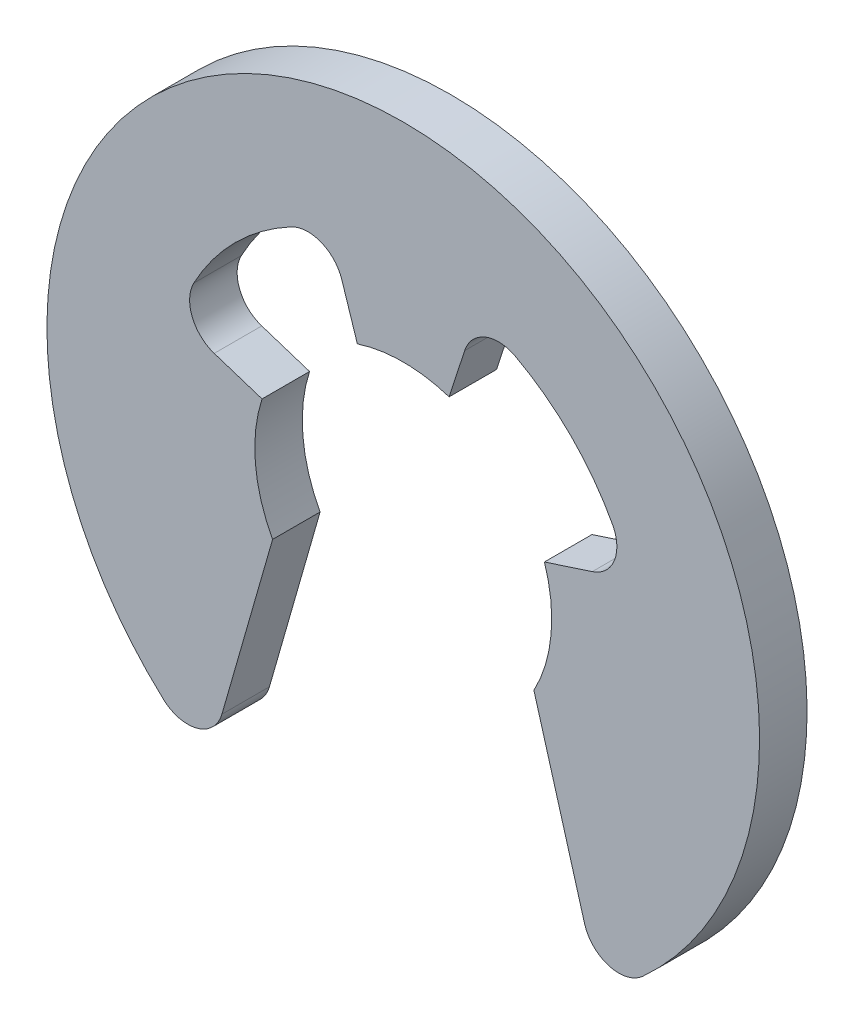
ISO-10303-21;
HEADER;
FILE_DESCRIPTION(('STEP AP214'),'2;1');
FILE_NAME('part.step','',(''),(''),'','','');
FILE_SCHEMA(('AUTOMOTIVE_DESIGN { 1 0 10303 214 1 1 1 1 }'));
ENDSEC;
DATA;
#1=APPLICATION_CONTEXT('core data for automotive mechanical design processes');
#2=APPLICATION_PROTOCOL_DEFINITION('international standard','automotive_design',2000,#1);
#3=PRODUCT_CONTEXT('',#1,'mechanical');
#4=PRODUCT('Part','Part','',(#3));
#5=PRODUCT_RELATED_PRODUCT_CATEGORY('part','',(#4));
#6=PRODUCT_DEFINITION_FORMATION('','',#4);
#7=PRODUCT_DEFINITION_CONTEXT('part definition',#1,'design');
#8=PRODUCT_DEFINITION('design','',#6,#7);
#9=PRODUCT_DEFINITION_SHAPE('','',#8);
#10=(LENGTH_UNIT() NAMED_UNIT(*) SI_UNIT(.MILLI.,.METRE.));
#11=(NAMED_UNIT(*) PLANE_ANGLE_UNIT() SI_UNIT($,.RADIAN.));
#12=(NAMED_UNIT(*) SI_UNIT($,.STERADIAN.) SOLID_ANGLE_UNIT());
#13=UNCERTAINTY_MEASURE_WITH_UNIT(LENGTH_MEASURE(1.E-05),#10,'distance_accuracy_value','');
#14=(GEOMETRIC_REPRESENTATION_CONTEXT(3) GLOBAL_UNCERTAINTY_ASSIGNED_CONTEXT((#13)) GLOBAL_UNIT_ASSIGNED_CONTEXT((#10,
#11,#12)) REPRESENTATION_CONTEXT('',''));
#15=CARTESIAN_POINT('',(0.,0.,0.));
#16=DIRECTION('',(0.,0.,1.));
#17=DIRECTION('',(1.,0.,0.));
#18=AXIS2_PLACEMENT_3D('',#15,#16,#17);
#19=CARTESIAN_POINT('',(1.49871684200533,0.802401288314995,-0.4));
#20=DIRECTION('',(0.,0.,1.));
#21=DIRECTION('',(1.,0.,0.));
#22=AXIS2_PLACEMENT_3D('',#19,#20,#21);
#23=CYLINDRICAL_SURFACE('',#22,0.3);
#24=CARTESIAN_POINT('',(1.49871684200533,0.802401288314995,0.));
#25=DIRECTION('',(0.,0.,-1.));
#26=DIRECTION('',(-1.,0.,0.));
#27=AXIS2_PLACEMENT_3D('',#24,#25,#26);
#28=CIRCLE('',#27,0.3);
#29=CARTESIAN_POINT('',(1.76319628471216,0.9440015156647,0.));
#30=VERTEX_POINT('',#29);
#31=CARTESIAN_POINT('',(1.59142194031782,0.51708433342645,0.));
#32=VERTEX_POINT('',#31);
#33=EDGE_CURVE('E191',#30,#32,#28,.T.);
#34=ORIENTED_EDGE('',*,*,#33,.F.);
#35=DIRECTION('',(0.,0.,1.));
#36=VECTOR('',#35,1.);
#37=CARTESIAN_POINT('',(1.76319628471216,0.9440015156647,-0.4));
#38=LINE('',#37,#36);
#39=CARTESIAN_POINT('',(1.76319628471216,0.9440015156647,-0.4));
#40=VERTEX_POINT('',#39);
#41=EDGE_CURVE('E11',#40,#30,#38,.T.);
#42=ORIENTED_EDGE('',*,*,#41,.F.);
#43=CARTESIAN_POINT('',(1.49871684200533,0.802401288314995,-0.4));
#44=DIRECTION('',(0.,0.,-1.));
#45=DIRECTION('',(-1.,0.,0.));
#46=AXIS2_PLACEMENT_3D('',#43,#44,#45);
#47=CIRCLE('',#46,0.3);
#48=CARTESIAN_POINT('',(1.59142194031782,0.51708433342645,-0.4));
#49=VERTEX_POINT('',#48);
#50=EDGE_CURVE('E241',#40,#49,#47,.T.);
#51=ORIENTED_EDGE('',*,*,#50,.T.);
#52=DIRECTION('',(0.,0.,1.));
#53=VECTOR('',#52,1.);
#54=CARTESIAN_POINT('',(1.59142194031782,0.51708433342645,-0.4));
#55=LINE('',#54,#53);
#56=EDGE_CURVE('E37',#49,#32,#55,.T.);
#57=ORIENTED_EDGE('',*,*,#56,.T.);
#58=EDGE_LOOP('',(#34,#42,#51,#57));
#59=FACE_BOUND('',#58,.T.);
#60=ADVANCED_FACE('F34',(#59),#23,.F.);
#61=CARTESIAN_POINT('',(0.,0.,-0.4));
#62=DIRECTION('',(0.,0.,1.));
#63=DIRECTION('',(1.,0.,0.));
#64=AXIS2_PLACEMENT_3D('',#61,#62,#63);
#65=CYLINDRICAL_SURFACE('',#64,2.);
#66=CARTESIAN_POINT('',(0.,0.,0.));
#67=DIRECTION('',(0.,0.,-1.));
#68=DIRECTION('',(1.,0.,0.));
#69=AXIS2_PLACEMENT_3D('',#66,#67,#68);
#70=CIRCLE('',#69,2.);
#71=CARTESIAN_POINT('',(0.944001515664686,1.76319628471216,0.));
#72=VERTEX_POINT('',#71);
#73=EDGE_CURVE('E239',#72,#30,#70,.T.);
#74=ORIENTED_EDGE('',*,*,#73,.F.);
#75=DIRECTION('',(0.,0.,1.));
#76=VECTOR('',#75,1.);
#77=CARTESIAN_POINT('',(0.944001515664686,1.76319628471216,-0.4));
#78=LINE('',#77,#76);
#79=CARTESIAN_POINT('',(0.944001515664686,1.76319628471216,-0.4));
#80=VERTEX_POINT('',#79);
#81=EDGE_CURVE('E43',#80,#72,#78,.T.);
#82=ORIENTED_EDGE('',*,*,#81,.F.);
#83=CARTESIAN_POINT('',(0.,0.,-0.4));
#84=DIRECTION('',(0.,0.,-1.));
#85=DIRECTION('',(1.,0.,0.));
#86=AXIS2_PLACEMENT_3D('',#83,#84,#85);
#87=CIRCLE('',#86,2.);
#88=EDGE_CURVE('E181',#80,#40,#87,.T.);
#89=ORIENTED_EDGE('',*,*,#88,.T.);
#90=ORIENTED_EDGE('',*,*,#41,.T.);
#91=EDGE_LOOP('',(#74,#82,#89,#90));
#92=FACE_BOUND('',#91,.T.);
#93=ADVANCED_FACE('F273',(#92),#65,.F.);
#94=CARTESIAN_POINT('',(0.802401288314984,1.49871684200534,-0.4));
#95=DIRECTION('',(0.,0.,1.));
#96=DIRECTION('',(1.,0.,0.));
#97=AXIS2_PLACEMENT_3D('',#94,#95,#96);
#98=CYLINDRICAL_SURFACE('',#97,0.3);
#99=CARTESIAN_POINT('',(0.802401288314984,1.49871684200534,0.));
#100=DIRECTION('',(0.,0.,-1.));
#101=DIRECTION('',(-1.,0.,0.));
#102=AXIS2_PLACEMENT_3D('',#99,#100,#101);
#103=CIRCLE('',#102,0.3);
#104=CARTESIAN_POINT('',(0.517084333426437,1.59142194031782,0.));
#105=VERTEX_POINT('',#104);
#106=EDGE_CURVE('E168',#105,#72,#103,.T.);
#107=ORIENTED_EDGE('',*,*,#106,.F.);
#108=DIRECTION('',(0.,0.,1.));
#109=VECTOR('',#108,1.);
#110=CARTESIAN_POINT('',(0.517084333426437,1.59142194031782,-0.4));
#111=LINE('',#110,#109);
#112=CARTESIAN_POINT('',(0.517084333426437,1.59142194031782,-0.4));
#113=VERTEX_POINT('',#112);
#114=EDGE_CURVE('E163',#113,#105,#111,.T.);
#115=ORIENTED_EDGE('',*,*,#114,.F.);
#116=CARTESIAN_POINT('',(0.802401288314984,1.49871684200534,-0.4));
#117=DIRECTION('',(0.,0.,-1.));
#118=DIRECTION('',(-1.,0.,0.));
#119=AXIS2_PLACEMENT_3D('',#116,#117,#118);
#120=CIRCLE('',#119,0.3);
#121=EDGE_CURVE('E166',#113,#80,#120,.T.);
#122=ORIENTED_EDGE('',*,*,#121,.T.);
#123=ORIENTED_EDGE('',*,*,#81,.T.);
#124=EDGE_LOOP('',(#107,#115,#122,#123));
#125=FACE_BOUND('',#124,.T.);
#126=ADVANCED_FACE('F165',(#125),#98,.F.);
#127=CARTESIAN_POINT('',(0.517084333426437,1.59142194031782,-0.4));
#128=DIRECTION('',(0.951056516295156,-0.309016994374941,0.));
#129=DIRECTION('',(0.309016994374941,0.951056516295156,0.));
#130=AXIS2_PLACEMENT_3D('',#127,#128,#129);
#131=PLANE('',#130);
#132=DIRECTION('',(0.309016994374941,0.951056516295156,0.));
#133=VECTOR('',#132,1.);
#134=CARTESIAN_POINT('',(0.517084333426437,1.59142194031782,0.));
#135=LINE('',#134,#133);
#136=CARTESIAN_POINT('',(0.386271242968676,1.18882064536895,0.));
#137=VERTEX_POINT('',#136);
#138=EDGE_CURVE('E236',#137,#105,#135,.T.);
#139=ORIENTED_EDGE('',*,*,#138,.F.);
#140=DIRECTION('',(0.,0.,1.));
#141=VECTOR('',#140,1.);
#142=CARTESIAN_POINT('',(0.386271242968676,1.18882064536895,-0.4));
#143=LINE('',#142,#141);
#144=CARTESIAN_POINT('',(0.386271242968676,1.18882064536895,-0.4));
#145=VERTEX_POINT('',#144);
#146=EDGE_CURVE('E173',#145,#137,#143,.T.);
#147=ORIENTED_EDGE('',*,*,#146,.F.);
#148=DIRECTION('',(0.309016994374941,0.951056516295156,0.));
#149=VECTOR('',#148,1.);
#150=CARTESIAN_POINT('',(0.517084333426437,1.59142194031782,-0.4));
#151=LINE('',#150,#149);
#152=EDGE_CURVE('E179',#145,#113,#151,.T.);
#153=ORIENTED_EDGE('',*,*,#152,.T.);
#154=ORIENTED_EDGE('',*,*,#114,.T.);
#155=EDGE_LOOP('',(#139,#147,#153,#154));
#156=FACE_BOUND('',#155,.T.);
#157=ADVANCED_FACE('F183',(#156),#131,.T.);
#158=CARTESIAN_POINT('',(0.,0.,-0.4));
#159=DIRECTION('',(0.,0.,1.));
#160=DIRECTION('',(1.,0.,0.));
#161=AXIS2_PLACEMENT_3D('',#158,#159,#160);
#162=CYLINDRICAL_SURFACE('',#161,1.25);
#163=CARTESIAN_POINT('',(0.,0.,0.));
#164=DIRECTION('',(0.,0.,-1.));
#165=DIRECTION('',(1.,0.,0.));
#166=AXIS2_PLACEMENT_3D('',#163,#164,#165);
#167=CIRCLE('',#166,1.25);
#168=CARTESIAN_POINT('',(-0.386271242968676,1.18882064536895,0.));
#169=VERTEX_POINT('',#168);
#170=EDGE_CURVE('E233',#169,#137,#167,.T.);
#171=ORIENTED_EDGE('',*,*,#170,.F.);
#172=DIRECTION('',(0.,0.,1.));
#173=VECTOR('',#172,1.);
#174=CARTESIAN_POINT('',(-0.386271242968676,1.18882064536895,-0.4));
#175=LINE('',#174,#173);
#176=CARTESIAN_POINT('',(-0.386271242968676,1.18882064536895,-0.4));
#177=VERTEX_POINT('',#176);
#178=EDGE_CURVE('E245',#177,#169,#175,.T.);
#179=ORIENTED_EDGE('',*,*,#178,.F.);
#180=CARTESIAN_POINT('',(0.,0.,-0.4));
#181=DIRECTION('',(0.,0.,-1.));
#182=DIRECTION('',(1.,0.,0.));
#183=AXIS2_PLACEMENT_3D('',#180,#181,#182);
#184=CIRCLE('',#183,1.25);
#185=EDGE_CURVE('E184',#177,#145,#184,.T.);
#186=ORIENTED_EDGE('',*,*,#185,.T.);
#187=ORIENTED_EDGE('',*,*,#146,.T.);
#188=EDGE_LOOP('',(#171,#179,#186,#187));
#189=FACE_BOUND('',#188,.T.);
#190=ADVANCED_FACE('F286',(#189),#162,.F.);
#191=CARTESIAN_POINT('',(-0.517084333426436,1.59142194031782,-0.4));
#192=DIRECTION('',(-0.951056516295156,-0.309016994374941,0.));
#193=DIRECTION('',(0.309016994374941,-0.951056516295156,0.));
#194=AXIS2_PLACEMENT_3D('',#191,#192,#193);
#195=PLANE('',#194);
#196=DIRECTION('',(0.309016994374941,-0.951056516295156,0.));
#197=VECTOR('',#196,1.);
#198=CARTESIAN_POINT('',(-0.517084333426436,1.59142194031782,0.));
#199=LINE('',#198,#197);
#200=CARTESIAN_POINT('',(-0.517084333426436,1.59142194031782,0.));
#201=VERTEX_POINT('',#200);
#202=EDGE_CURVE('E230',#201,#169,#199,.T.);
#203=ORIENTED_EDGE('',*,*,#202,.F.);
#204=DIRECTION('',(0.,0.,1.));
#205=VECTOR('',#204,1.);
#206=CARTESIAN_POINT('',(-0.517084333426436,1.59142194031782,-0.4));
#207=LINE('',#206,#205);
#208=CARTESIAN_POINT('',(-0.517084333426436,1.59142194031782,-0.4));
#209=VERTEX_POINT('',#208);
#210=EDGE_CURVE('E247',#209,#201,#207,.T.);
#211=ORIENTED_EDGE('',*,*,#210,.F.);
#212=DIRECTION('',(0.309016994374941,-0.951056516295156,0.));
#213=VECTOR('',#212,1.);
#214=CARTESIAN_POINT('',(-0.517084333426436,1.59142194031782,-0.4));
#215=LINE('',#214,#213);
#216=EDGE_CURVE('E186',#209,#177,#215,.T.);
#217=ORIENTED_EDGE('',*,*,#216,.T.);
#218=ORIENTED_EDGE('',*,*,#178,.T.);
#219=EDGE_LOOP('',(#203,#211,#217,#218));
#220=FACE_BOUND('',#219,.T.);
#221=ADVANCED_FACE('F289',(#220),#195,.T.);
#222=CARTESIAN_POINT('',(-0.802401288314983,1.49871684200534,-0.4));
#223=DIRECTION('',(0.,0.,1.));
#224=DIRECTION('',(1.,0.,0.));
#225=AXIS2_PLACEMENT_3D('',#222,#223,#224);
#226=CYLINDRICAL_SURFACE('',#225,0.3);
#227=CARTESIAN_POINT('',(-0.802401288314983,1.49871684200534,0.));
#228=DIRECTION('',(0.,0.,-1.));
#229=DIRECTION('',(1.,0.,0.));
#230=AXIS2_PLACEMENT_3D('',#227,#228,#229);
#231=CIRCLE('',#230,0.3);
#232=CARTESIAN_POINT('',(-0.944001515664686,1.76319628471216,0.));
#233=VERTEX_POINT('',#232);
#234=EDGE_CURVE('E227',#233,#201,#231,.T.);
#235=ORIENTED_EDGE('',*,*,#234,.F.);
#236=DIRECTION('',(0.,0.,1.));
#237=VECTOR('',#236,1.);
#238=CARTESIAN_POINT('',(-0.944001515664686,1.76319628471216,-0.4));
#239=LINE('',#238,#237);
#240=CARTESIAN_POINT('',(-0.944001515664686,1.76319628471216,-0.4));
#241=VERTEX_POINT('',#240);
#242=EDGE_CURVE('E249',#241,#233,#239,.T.);
#243=ORIENTED_EDGE('',*,*,#242,.F.);
#244=CARTESIAN_POINT('',(-0.802401288314983,1.49871684200534,-0.4));
#245=DIRECTION('',(0.,0.,-1.));
#246=DIRECTION('',(1.,0.,0.));
#247=AXIS2_PLACEMENT_3D('',#244,#245,#246);
#248=CIRCLE('',#247,0.3);
#249=EDGE_CURVE('E497',#241,#209,#248,.T.);
#250=ORIENTED_EDGE('',*,*,#249,.T.);
#251=ORIENTED_EDGE('',*,*,#210,.T.);
#252=EDGE_LOOP('',(#235,#243,#250,#251));
#253=FACE_BOUND('',#252,.T.);
#254=ADVANCED_FACE('F293',(#253),#226,.F.);
#255=CARTESIAN_POINT('',(0.,0.,-0.4));
#256=DIRECTION('',(0.,0.,1.));
#257=DIRECTION('',(1.,0.,0.));
#258=AXIS2_PLACEMENT_3D('',#255,#256,#257);
#259=CYLINDRICAL_SURFACE('',#258,2.);
#260=CARTESIAN_POINT('',(0.,0.,0.));
#261=DIRECTION('',(0.,0.,-1.));
#262=DIRECTION('',(-1.,0.,0.));
#263=AXIS2_PLACEMENT_3D('',#260,#261,#262);
#264=CIRCLE('',#263,2.);
#265=CARTESIAN_POINT('',(-1.76319628471216,0.9440015156647,0.));
#266=VERTEX_POINT('',#265);
#267=EDGE_CURVE('E224',#266,#233,#264,.T.);
#268=ORIENTED_EDGE('',*,*,#267,.F.);
#269=DIRECTION('',(0.,0.,1.));
#270=VECTOR('',#269,1.);
#271=CARTESIAN_POINT('',(-1.76319628471216,0.9440015156647,-0.4));
#272=LINE('',#271,#270);
#273=CARTESIAN_POINT('',(-1.76319628471216,0.9440015156647,-0.4));
#274=VERTEX_POINT('',#273);
#275=EDGE_CURVE('E251',#274,#266,#272,.T.);
#276=ORIENTED_EDGE('',*,*,#275,.F.);
#277=CARTESIAN_POINT('',(0.,0.,-0.4));
#278=DIRECTION('',(0.,0.,-1.));
#279=DIRECTION('',(-1.,0.,0.));
#280=AXIS2_PLACEMENT_3D('',#277,#278,#279);
#281=CIRCLE('',#280,2.);
#282=EDGE_CURVE('E501',#274,#241,#281,.T.);
#283=ORIENTED_EDGE('',*,*,#282,.T.);
#284=ORIENTED_EDGE('',*,*,#242,.T.);
#285=EDGE_LOOP('',(#268,#276,#283,#284));
#286=FACE_BOUND('',#285,.T.);
#287=ADVANCED_FACE('F297',(#286),#259,.F.);
#288=CARTESIAN_POINT('',(-1.49871684200533,0.802401288314995,-0.4));
#289=DIRECTION('',(0.,0.,1.));
#290=DIRECTION('',(1.,0.,0.));
#291=AXIS2_PLACEMENT_3D('',#288,#289,#290);
#292=CYLINDRICAL_SURFACE('',#291,0.3);
#293=CARTESIAN_POINT('',(-1.49871684200533,0.802401288314995,0.));
#294=DIRECTION('',(0.,0.,-1.));
#295=DIRECTION('',(1.,0.,0.));
#296=AXIS2_PLACEMENT_3D('',#293,#294,#295);
#297=CIRCLE('',#296,0.3);
#298=CARTESIAN_POINT('',(-1.59142194031782,0.517084333426449,0.));
#299=VERTEX_POINT('',#298);
#300=EDGE_CURVE('E221',#299,#266,#297,.T.);
#301=ORIENTED_EDGE('',*,*,#300,.F.);
#302=DIRECTION('',(0.,0.,1.));
#303=VECTOR('',#302,1.);
#304=CARTESIAN_POINT('',(-1.59142194031782,0.517084333426449,-0.4));
#305=LINE('',#304,#303);
#306=CARTESIAN_POINT('',(-1.59142194031782,0.517084333426449,-0.4));
#307=VERTEX_POINT('',#306);
#308=EDGE_CURVE('E253',#307,#299,#305,.T.);
#309=ORIENTED_EDGE('',*,*,#308,.F.);
#310=CARTESIAN_POINT('',(-1.49871684200533,0.802401288314995,-0.4));
#311=DIRECTION('',(0.,0.,-1.));
#312=DIRECTION('',(1.,0.,0.));
#313=AXIS2_PLACEMENT_3D('',#310,#311,#312);
#314=CIRCLE('',#313,0.3);
#315=EDGE_CURVE('E490',#307,#274,#314,.T.);
#316=ORIENTED_EDGE('',*,*,#315,.T.);
#317=ORIENTED_EDGE('',*,*,#275,.T.);
#318=EDGE_LOOP('',(#301,#309,#316,#317));
#319=FACE_BOUND('',#318,.T.);
#320=ADVANCED_FACE('F301',(#319),#292,.F.);
#321=CARTESIAN_POINT('',(-1.18882064536894,0.386271242968686,-0.4));
#322=DIRECTION('',(0.309016994374948,0.951056516295153,0.));
#323=DIRECTION('',(-0.951056516295153,0.309016994374948,0.));
#324=AXIS2_PLACEMENT_3D('',#321,#322,#323);
#325=PLANE('',#324);
#326=DIRECTION('',(-0.951056516295153,0.309016994374948,0.));
#327=VECTOR('',#326,1.);
#328=CARTESIAN_POINT('',(-1.18882064536894,0.386271242968686,0.));
#329=LINE('',#328,#327);
#330=CARTESIAN_POINT('',(-1.18882064536894,0.386271242968686,0.));
#331=VERTEX_POINT('',#330);
#332=EDGE_CURVE('E218',#331,#299,#329,.T.);
#333=ORIENTED_EDGE('',*,*,#332,.F.);
#334=DIRECTION('',(0.,0.,1.));
#335=VECTOR('',#334,1.);
#336=CARTESIAN_POINT('',(-1.18882064536894,0.386271242968686,-0.4));
#337=LINE('',#336,#335);
#338=CARTESIAN_POINT('',(-1.18882064536894,0.386271242968686,-0.4));
#339=VERTEX_POINT('',#338);
#340=EDGE_CURVE('E255',#339,#331,#337,.T.);
#341=ORIENTED_EDGE('',*,*,#340,.F.);
#342=DIRECTION('',(-0.951056516295153,0.309016994374948,0.));
#343=VECTOR('',#342,1.);
#344=CARTESIAN_POINT('',(-1.18882064536894,0.386271242968686,-0.4));
#345=LINE('',#344,#343);
#346=EDGE_CURVE('E486',#339,#307,#345,.T.);
#347=ORIENTED_EDGE('',*,*,#346,.T.);
#348=ORIENTED_EDGE('',*,*,#308,.T.);
#349=EDGE_LOOP('',(#333,#341,#347,#348));
#350=FACE_BOUND('',#349,.T.);
#351=ADVANCED_FACE('F305',(#350),#325,.T.);
#352=CARTESIAN_POINT('',(0.,0.,-0.4));
#353=DIRECTION('',(0.,0.,1.));
#354=DIRECTION('',(1.,0.,0.));
#355=AXIS2_PLACEMENT_3D('',#352,#353,#354);
#356=CYLINDRICAL_SURFACE('',#355,1.25);
#357=CARTESIAN_POINT('',(0.,0.,0.));
#358=DIRECTION('',(0.,0.,-1.));
#359=DIRECTION('',(-1.,0.,0.));
#360=AXIS2_PLACEMENT_3D('',#357,#358,#359);
#361=CIRCLE('',#360,1.25);
#362=CARTESIAN_POINT('',(-1.1,-0.593717104351896,0.));
#363=VERTEX_POINT('',#362);
#364=EDGE_CURVE('E215',#363,#331,#361,.T.);
#365=ORIENTED_EDGE('',*,*,#364,.F.);
#366=DIRECTION('',(0.,0.,1.));
#367=VECTOR('',#366,1.);
#368=CARTESIAN_POINT('',(-1.1,-0.593717104351896,-0.4));
#369=LINE('',#368,#367);
#370=CARTESIAN_POINT('',(-1.1,-0.593717104351896,-0.4));
#371=VERTEX_POINT('',#370);
#372=EDGE_CURVE('E257',#371,#363,#369,.T.);
#373=ORIENTED_EDGE('',*,*,#372,.F.);
#374=CARTESIAN_POINT('',(0.,0.,-0.4));
#375=DIRECTION('',(0.,0.,-1.));
#376=DIRECTION('',(-1.,0.,0.));
#377=AXIS2_PLACEMENT_3D('',#374,#375,#376);
#378=CIRCLE('',#377,1.25);
#379=EDGE_CURVE('E507',#371,#339,#378,.T.);
#380=ORIENTED_EDGE('',*,*,#379,.T.);
#381=ORIENTED_EDGE('',*,*,#340,.T.);
#382=EDGE_LOOP('',(#365,#373,#380,#381));
#383=FACE_BOUND('',#382,.T.);
#384=ADVANCED_FACE('F309',(#383),#356,.F.);
#385=CARTESIAN_POINT('',(-1.1,-0.593717104351896,-0.4));
#386=DIRECTION('',(0.961261695938319,-0.275637355817,0.));
#387=DIRECTION('',(0.275637355817,0.961261695938319,0.));
#388=AXIS2_PLACEMENT_3D('',#385,#386,#387);
#389=PLANE('',#388);
#390=DIRECTION('',(0.275637355817,0.961261695938318,0.));
#391=VECTOR('',#390,1.);
#392=CARTESIAN_POINT('',(-1.1,-0.593717104351896,0.));
#393=LINE('',#392,#391);
#394=CARTESIAN_POINT('',(-1.52664688655386,-2.08161161893958,0.));
#395=VERTEX_POINT('',#394);
#396=EDGE_CURVE('E212',#395,#363,#393,.T.);
#397=ORIENTED_EDGE('',*,*,#396,.F.);
#398=DIRECTION('',(0.,0.,1.));
#399=VECTOR('',#398,1.);
#400=CARTESIAN_POINT('',(-1.52664688655386,-2.08161161893958,-0.4));
#401=LINE('',#400,#399);
#402=CARTESIAN_POINT('',(-1.52664688655386,-2.08161161893958,-0.4));
#403=VERTEX_POINT('',#402);
#404=EDGE_CURVE('E259',#403,#395,#401,.T.);
#405=ORIENTED_EDGE('',*,*,#404,.F.);
#406=DIRECTION('',(0.275637355817,0.961261695938318,0.));
#407=VECTOR('',#406,1.);
#408=CARTESIAN_POINT('',(-1.1,-0.593717104351896,-0.4));
#409=LINE('',#408,#407);
#410=EDGE_CURVE('E479',#403,#371,#409,.T.);
#411=ORIENTED_EDGE('',*,*,#410,.T.);
#412=ORIENTED_EDGE('',*,*,#372,.T.);
#413=EDGE_LOOP('',(#397,#405,#411,#412));
#414=FACE_BOUND('',#413,.T.);
#415=ADVANCED_FACE('F313',(#414),#389,.T.);
#416=CARTESIAN_POINT('',(-1.81502539533536,-1.99892041219448,-0.4));
#417=DIRECTION('',(0.,0.,1.));
#418=DIRECTION('',(1.,0.,0.));
#419=AXIS2_PLACEMENT_3D('',#416,#417,#418);
#420=CYLINDRICAL_SURFACE('',#419,0.3);
#421=CARTESIAN_POINT('',(-1.81502539533536,-1.99892041219448,0.));
#422=DIRECTION('',(0.,0.,1.));
#423=DIRECTION('',(-1.,0.,0.));
#424=AXIS2_PLACEMENT_3D('',#421,#422,#423);
#425=CIRCLE('',#424,0.3);
#426=CARTESIAN_POINT('',(-2.01669488370595,-2.22102268021608,0.));
#427=VERTEX_POINT('',#426);
#428=EDGE_CURVE('E209',#427,#395,#425,.T.);
#429=ORIENTED_EDGE('',*,*,#428,.F.);
#430=DIRECTION('',(0.,0.,1.));
#431=VECTOR('',#430,1.);
#432=CARTESIAN_POINT('',(-2.01669488370595,-2.22102268021608,-0.4));
#433=LINE('',#432,#431);
#434=CARTESIAN_POINT('',(-2.01669488370595,-2.22102268021608,-0.4));
#435=VERTEX_POINT('',#434);
#436=EDGE_CURVE('E261',#435,#427,#433,.T.);
#437=ORIENTED_EDGE('',*,*,#436,.F.);
#438=CARTESIAN_POINT('',(-1.81502539533536,-1.99892041219448,-0.4));
#439=DIRECTION('',(0.,0.,1.));
#440=DIRECTION('',(-1.,0.,0.));
#441=AXIS2_PLACEMENT_3D('',#438,#439,#440);
#442=CIRCLE('',#441,0.3);
#443=EDGE_CURVE('E475',#435,#403,#442,.T.);
#444=ORIENTED_EDGE('',*,*,#443,.T.);
#445=ORIENTED_EDGE('',*,*,#404,.T.);
#446=EDGE_LOOP('',(#429,#437,#444,#445));
#447=FACE_BOUND('',#446,.T.);
#448=ADVANCED_FACE('F317',(#447),#420,.T.);
#449=CARTESIAN_POINT('',(0.,0.,-0.4));
#450=DIRECTION('',(0.,0.,1.));
#451=DIRECTION('',(1.,0.,0.));
#452=AXIS2_PLACEMENT_3D('',#449,#450,#451);
#453=CYLINDRICAL_SURFACE('',#452,3.);
#454=CARTESIAN_POINT('',(0.,0.,0.));
#455=DIRECTION('',(0.,0.,1.));
#456=DIRECTION('',(1.,0.,0.));
#457=AXIS2_PLACEMENT_3D('',#454,#455,#456);
#458=CIRCLE('',#457,3.);
#459=CARTESIAN_POINT('',(2.01669488370595,-2.22102268021608,0.));
#460=VERTEX_POINT('',#459);
#461=EDGE_CURVE('E206',#460,#427,#458,.T.);
#462=ORIENTED_EDGE('',*,*,#461,.F.);
#463=DIRECTION('',(0.,0.,1.));
#464=VECTOR('',#463,1.);
#465=CARTESIAN_POINT('',(2.01669488370595,-2.22102268021608,-0.4));
#466=LINE('',#465,#464);
#467=CARTESIAN_POINT('',(2.01669488370595,-2.22102268021608,-0.4));
#468=VERTEX_POINT('',#467);
#469=EDGE_CURVE('E263',#468,#460,#466,.T.);
#470=ORIENTED_EDGE('',*,*,#469,.F.);
#471=CARTESIAN_POINT('',(0.,0.,-0.4));
#472=DIRECTION('',(0.,0.,1.));
#473=DIRECTION('',(1.,0.,0.));
#474=AXIS2_PLACEMENT_3D('',#471,#472,#473);
#475=CIRCLE('',#474,3.);
#476=EDGE_CURVE('E511',#468,#435,#475,.T.);
#477=ORIENTED_EDGE('',*,*,#476,.T.);
#478=ORIENTED_EDGE('',*,*,#436,.T.);
#479=EDGE_LOOP('',(#462,#470,#477,#478));
#480=FACE_BOUND('',#479,.T.);
#481=ADVANCED_FACE('F321',(#480),#453,.T.);
#482=CARTESIAN_POINT('',(1.81502539533536,-1.99892041219448,-0.4));
#483=DIRECTION('',(0.,0.,1.));
#484=DIRECTION('',(1.,0.,0.));
#485=AXIS2_PLACEMENT_3D('',#482,#483,#484);
#486=CYLINDRICAL_SURFACE('',#485,0.3);
#487=CARTESIAN_POINT('',(1.81502539533536,-1.99892041219448,0.));
#488=DIRECTION('',(0.,0.,1.));
#489=DIRECTION('',(1.,0.,0.));
#490=AXIS2_PLACEMENT_3D('',#487,#488,#489);
#491=CIRCLE('',#490,0.3);
#492=CARTESIAN_POINT('',(1.52664688655386,-2.08161161893958,0.));
#493=VERTEX_POINT('',#492);
#494=EDGE_CURVE('E203',#493,#460,#491,.T.);
#495=ORIENTED_EDGE('',*,*,#494,.F.);
#496=DIRECTION('',(0.,0.,1.));
#497=VECTOR('',#496,1.);
#498=CARTESIAN_POINT('',(1.52664688655386,-2.08161161893958,-0.4));
#499=LINE('',#498,#497);
#500=CARTESIAN_POINT('',(1.52664688655386,-2.08161161893958,-0.4));
#501=VERTEX_POINT('',#500);
#502=EDGE_CURVE('E265',#501,#493,#499,.T.);
#503=ORIENTED_EDGE('',*,*,#502,.F.);
#504=CARTESIAN_POINT('',(1.81502539533536,-1.99892041219448,-0.4));
#505=DIRECTION('',(0.,0.,1.));
#506=DIRECTION('',(1.,0.,0.));
#507=AXIS2_PLACEMENT_3D('',#504,#505,#506);
#508=CIRCLE('',#507,0.3);
#509=EDGE_CURVE('E468',#501,#468,#508,.T.);
#510=ORIENTED_EDGE('',*,*,#509,.T.);
#511=ORIENTED_EDGE('',*,*,#469,.T.);
#512=EDGE_LOOP('',(#495,#503,#510,#511));
#513=FACE_BOUND('',#512,.T.);
#514=ADVANCED_FACE('F325',(#513),#486,.T.);
#515=CARTESIAN_POINT('',(1.1,-0.593717104351896,-0.4));
#516=DIRECTION('',(-0.961261695938319,-0.275637355817001,0.));
#517=DIRECTION('',(0.275637355817001,-0.961261695938319,0.));
#518=AXIS2_PLACEMENT_3D('',#515,#516,#517);
#519=PLANE('',#518);
#520=DIRECTION('',(0.275637355817001,-0.961261695938318,0.));
#521=VECTOR('',#520,1.);
#522=CARTESIAN_POINT('',(1.1,-0.593717104351896,0.));
#523=LINE('',#522,#521);
#524=CARTESIAN_POINT('',(1.1,-0.593717104351896,0.));
#525=VERTEX_POINT('',#524);
#526=EDGE_CURVE('E200',#525,#493,#523,.T.);
#527=ORIENTED_EDGE('',*,*,#526,.F.);
#528=DIRECTION('',(0.,0.,1.));
#529=VECTOR('',#528,1.);
#530=CARTESIAN_POINT('',(1.1,-0.593717104351896,-0.4));
#531=LINE('',#530,#529);
#532=CARTESIAN_POINT('',(1.1,-0.593717104351896,-0.4));
#533=VERTEX_POINT('',#532);
#534=EDGE_CURVE('E267',#533,#525,#531,.T.);
#535=ORIENTED_EDGE('',*,*,#534,.F.);
#536=DIRECTION('',(0.275637355817001,-0.961261695938318,0.));
#537=VECTOR('',#536,1.);
#538=CARTESIAN_POINT('',(1.1,-0.593717104351896,-0.4));
#539=LINE('',#538,#537);
#540=EDGE_CURVE('E464',#533,#501,#539,.T.);
#541=ORIENTED_EDGE('',*,*,#540,.T.);
#542=ORIENTED_EDGE('',*,*,#502,.T.);
#543=EDGE_LOOP('',(#527,#535,#541,#542));
#544=FACE_BOUND('',#543,.T.);
#545=ADVANCED_FACE('F329',(#544),#519,.T.);
#546=CARTESIAN_POINT('',(0.,0.,-0.4));
#547=DIRECTION('',(0.,0.,1.));
#548=DIRECTION('',(1.,0.,0.));
#549=AXIS2_PLACEMENT_3D('',#546,#547,#548);
#550=CYLINDRICAL_SURFACE('',#549,1.25);
#551=CARTESIAN_POINT('',(0.,0.,0.));
#552=DIRECTION('',(0.,0.,-1.));
#553=DIRECTION('',(1.,0.,0.));
#554=AXIS2_PLACEMENT_3D('',#551,#552,#553);
#555=CIRCLE('',#554,1.25);
#556=CARTESIAN_POINT('',(1.18882064536894,0.386271242968685,0.));
#557=VERTEX_POINT('',#556);
#558=EDGE_CURVE('E197',#557,#525,#555,.T.);
#559=ORIENTED_EDGE('',*,*,#558,.F.);
#560=DIRECTION('',(0.,0.,1.));
#561=VECTOR('',#560,1.);
#562=CARTESIAN_POINT('',(1.18882064536894,0.386271242968685,-0.4));
#563=LINE('',#562,#561);
#564=CARTESIAN_POINT('',(1.18882064536894,0.386271242968685,-0.4));
#565=VERTEX_POINT('',#564);
#566=EDGE_CURVE('E268',#565,#557,#563,.T.);
#567=ORIENTED_EDGE('',*,*,#566,.F.);
#568=CARTESIAN_POINT('',(0.,0.,-0.4));
#569=DIRECTION('',(0.,0.,-1.));
#570=DIRECTION('',(1.,0.,0.));
#571=AXIS2_PLACEMENT_3D('',#568,#569,#570);
#572=CIRCLE('',#571,1.25);
#573=EDGE_CURVE('E515',#565,#533,#572,.T.);
#574=ORIENTED_EDGE('',*,*,#573,.T.);
#575=ORIENTED_EDGE('',*,*,#534,.T.);
#576=EDGE_LOOP('',(#559,#567,#574,#575));
#577=FACE_BOUND('',#576,.T.);
#578=ADVANCED_FACE('F333',(#577),#550,.F.);
#579=CARTESIAN_POINT('',(1.18882064536894,0.386271242968686,-0.4));
#580=DIRECTION('',(-0.309016994374949,0.951056516295153,0.));
#581=DIRECTION('',(-0.951056516295153,-0.309016994374949,0.));
#582=AXIS2_PLACEMENT_3D('',#579,#580,#581);
#583=PLANE('',#582);
#584=DIRECTION('',(-0.951056516295153,-0.309016994374949,0.));
#585=VECTOR('',#584,1.);
#586=CARTESIAN_POINT('',(1.18882064536894,0.386271242968686,0.));
#587=LINE('',#586,#585);
#588=EDGE_CURVE('E194',#32,#557,#587,.T.);
#589=ORIENTED_EDGE('',*,*,#588,.F.);
#590=ORIENTED_EDGE('',*,*,#56,.F.);
#591=DIRECTION('',(-0.951056516295153,-0.309016994374949,0.));
#592=VECTOR('',#591,1.);
#593=CARTESIAN_POINT('',(1.18882064536894,0.386271242968686,-0.4));
#594=LINE('',#593,#592);
#595=EDGE_CURVE('E517',#49,#565,#594,.T.);
#596=ORIENTED_EDGE('',*,*,#595,.T.);
#597=ORIENTED_EDGE('',*,*,#566,.T.);
#598=EDGE_LOOP('',(#589,#590,#596,#597));
#599=FACE_BOUND('',#598,.T.);
#600=ADVANCED_FACE('F270',(#599),#583,.T.);
#601=CARTESIAN_POINT('',(1.49871684200533,0.802401288314995,-0.4));
#602=DIRECTION('',(0.,0.,-1.));
#603=DIRECTION('',(-1.,0.,0.));
#604=AXIS2_PLACEMENT_3D('',#601,#602,#603);
#605=PLANE('',#604);
#606=ORIENTED_EDGE('',*,*,#50,.F.);
#607=ORIENTED_EDGE('',*,*,#88,.F.);
#608=ORIENTED_EDGE('',*,*,#121,.F.);
#609=ORIENTED_EDGE('',*,*,#152,.F.);
#610=ORIENTED_EDGE('',*,*,#185,.F.);
#611=ORIENTED_EDGE('',*,*,#216,.F.);
#612=ORIENTED_EDGE('',*,*,#249,.F.);
#613=ORIENTED_EDGE('',*,*,#282,.F.);
#614=ORIENTED_EDGE('',*,*,#315,.F.);
#615=ORIENTED_EDGE('',*,*,#346,.F.);
#616=ORIENTED_EDGE('',*,*,#379,.F.);
#617=ORIENTED_EDGE('',*,*,#410,.F.);
#618=ORIENTED_EDGE('',*,*,#443,.F.);
#619=ORIENTED_EDGE('',*,*,#476,.F.);
#620=ORIENTED_EDGE('',*,*,#509,.F.);
#621=ORIENTED_EDGE('',*,*,#540,.F.);
#622=ORIENTED_EDGE('',*,*,#573,.F.);
#623=ORIENTED_EDGE('',*,*,#595,.F.);
#624=EDGE_LOOP('',(#606,#607,#608,#609,#610,#611,#612,#613,#614,#615,#616,#617,#618,#619,#620,
#621,#622,#623));
#625=FACE_BOUND('',#624,.T.);
#626=ADVANCED_FACE('F177',(#625),#605,.T.);
#627=CARTESIAN_POINT('',(1.49871684200533,0.802401288314995,0.));
#628=DIRECTION('',(0.,0.,-1.));
#629=DIRECTION('',(-1.,0.,0.));
#630=AXIS2_PLACEMENT_3D('',#627,#628,#629);
#631=PLANE('',#630);
#632=ORIENTED_EDGE('',*,*,#33,.T.);
#633=ORIENTED_EDGE('',*,*,#588,.T.);
#634=ORIENTED_EDGE('',*,*,#558,.T.);
#635=ORIENTED_EDGE('',*,*,#526,.T.);
#636=ORIENTED_EDGE('',*,*,#494,.T.);
#637=ORIENTED_EDGE('',*,*,#461,.T.);
#638=ORIENTED_EDGE('',*,*,#428,.T.);
#639=ORIENTED_EDGE('',*,*,#396,.T.);
#640=ORIENTED_EDGE('',*,*,#364,.T.);
#641=ORIENTED_EDGE('',*,*,#332,.T.);
#642=ORIENTED_EDGE('',*,*,#300,.T.);
#643=ORIENTED_EDGE('',*,*,#267,.T.);
#644=ORIENTED_EDGE('',*,*,#234,.T.);
#645=ORIENTED_EDGE('',*,*,#202,.T.);
#646=ORIENTED_EDGE('',*,*,#170,.T.);
#647=ORIENTED_EDGE('',*,*,#138,.T.);
#648=ORIENTED_EDGE('',*,*,#106,.T.);
#649=ORIENTED_EDGE('',*,*,#73,.T.);
#650=EDGE_LOOP('',(#632,#633,#634,#635,#636,#637,#638,#639,#640,#641,#642,#643,#644,#645,#646,
#647,#648,#649));
#651=FACE_BOUND('',#650,.T.);
#652=ADVANCED_FACE('F272',(#651),#631,.F.);
#653=CLOSED_SHELL('',(#60,#93,#126,#157,#190,#221,#254,#287,#320,#351,#384,#415,#448,#481,#514,
#545,#578,#600,#626,#652));
#654=MANIFOLD_SOLID_BREP('B2',#653);
#655=ADVANCED_BREP_SHAPE_REPRESENTATION('',(#18,#654),#14);
#656=SHAPE_DEFINITION_REPRESENTATION(#9,#655);
ENDSEC;
END-ISO-10303-21;
